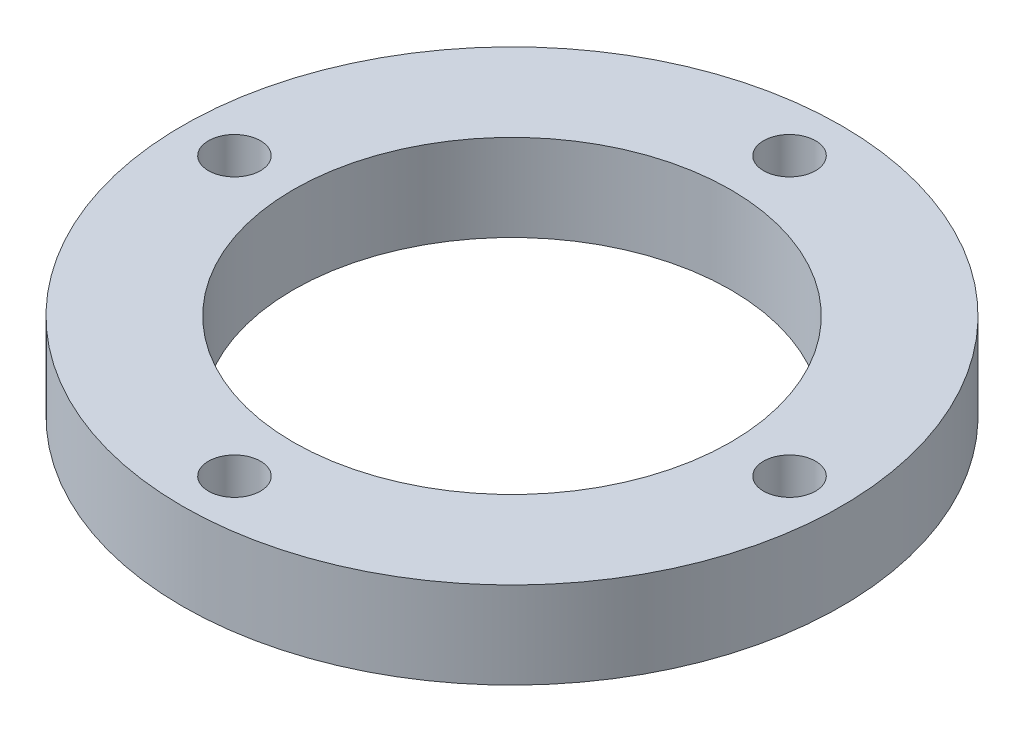
ISO-10303-21;
HEADER;
FILE_DESCRIPTION(('STEP AP214'),'2;1');
FILE_NAME('part.step','',(''),(''),'','','');
FILE_SCHEMA(('AUTOMOTIVE_DESIGN { 1 0 10303 214 1 1 1 1 }'));
ENDSEC;
DATA;
#1=APPLICATION_CONTEXT('core data for automotive mechanical design processes');
#2=APPLICATION_PROTOCOL_DEFINITION('international standard','automotive_design',2000,#1);
#3=PRODUCT_CONTEXT('',#1,'mechanical');
#4=PRODUCT('Part','Part','',(#3));
#5=PRODUCT_RELATED_PRODUCT_CATEGORY('part','',(#4));
#6=PRODUCT_DEFINITION_FORMATION('','',#4);
#7=PRODUCT_DEFINITION_CONTEXT('part definition',#1,'design');
#8=PRODUCT_DEFINITION('design','',#6,#7);
#9=PRODUCT_DEFINITION_SHAPE('','',#8);
#10=(LENGTH_UNIT() NAMED_UNIT(*) SI_UNIT(.MILLI.,.METRE.));
#11=(NAMED_UNIT(*) PLANE_ANGLE_UNIT() SI_UNIT($,.RADIAN.));
#12=(NAMED_UNIT(*) SI_UNIT($,.STERADIAN.) SOLID_ANGLE_UNIT());
#13=UNCERTAINTY_MEASURE_WITH_UNIT(LENGTH_MEASURE(1.E-05),#10,'distance_accuracy_value','');
#14=(GEOMETRIC_REPRESENTATION_CONTEXT(3) GLOBAL_UNCERTAINTY_ASSIGNED_CONTEXT((#13)) GLOBAL_UNIT_ASSIGNED_CONTEXT((#10,
#11,#12)) REPRESENTATION_CONTEXT('',''));
#15=CARTESIAN_POINT('',(0.,0.,0.));
#16=DIRECTION('',(0.,0.,1.));
#17=DIRECTION('',(1.,0.,0.));
#18=AXIS2_PLACEMENT_3D('',#15,#16,#17);
#19=CARTESIAN_POINT('',(0.,5.,0.));
#20=DIRECTION('',(0.,1.,0.));
#21=DIRECTION('',(0.,0.,1.));
#22=AXIS2_PLACEMENT_3D('',#19,#20,#21);
#23=PLANE('',#22);
#24=CARTESIAN_POINT('',(-16.,5.,-1.6759120133325E-13));
#25=DIRECTION('',(0.,1.,0.));
#26=DIRECTION('',(0.,0.,1.));
#27=AXIS2_PLACEMENT_3D('',#24,#25,#26);
#28=CIRCLE('',#27,1.5);
#29=CARTESIAN_POINT('',(-16.,5.,1.49999999999983));
#30=VERTEX_POINT('',#29);
#31=EDGE_CURVE('E66',#30,#30,#28,.T.);
#32=ORIENTED_EDGE('',*,*,#31,.F.);
#33=EDGE_LOOP('',(#32));
#34=FACE_BOUND('',#33,.T.);
#35=CARTESIAN_POINT('',(-1.117274675555E-13,5.,16.));
#36=DIRECTION('',(0.,1.,0.));
#37=DIRECTION('',(0.,0.,1.));
#38=AXIS2_PLACEMENT_3D('',#35,#36,#37);
#39=CIRCLE('',#38,1.5);
#40=CARTESIAN_POINT('',(-1.117274675555E-13,5.,17.5));
#41=VERTEX_POINT('',#40);
#42=EDGE_CURVE('E60',#41,#41,#39,.T.);
#43=ORIENTED_EDGE('',*,*,#42,.F.);
#44=EDGE_LOOP('',(#43));
#45=FACE_BOUND('',#44,.T.);
#46=CARTESIAN_POINT('',(16.,5.,0.));
#47=DIRECTION('',(0.,1.,0.));
#48=DIRECTION('',(0.,0.,1.));
#49=AXIS2_PLACEMENT_3D('',#46,#47,#48);
#50=CIRCLE('',#49,1.5);
#51=CARTESIAN_POINT('',(16.,5.,1.50000000000006));
#52=VERTEX_POINT('',#51);
#53=EDGE_CURVE('E54',#52,#52,#50,.T.);
#54=ORIENTED_EDGE('',*,*,#53,.F.);
#55=EDGE_LOOP('',(#54));
#56=FACE_BOUND('',#55,.T.);
#57=CARTESIAN_POINT('',(0.,5.,-16.));
#58=DIRECTION('',(0.,1.,0.));
#59=DIRECTION('',(0.,0.,1.));
#60=AXIS2_PLACEMENT_3D('',#57,#58,#59);
#61=CIRCLE('',#60,1.5);
#62=CARTESIAN_POINT('',(0.,5.,-14.5));
#63=VERTEX_POINT('',#62);
#64=EDGE_CURVE('E48',#63,#63,#61,.T.);
#65=ORIENTED_EDGE('',*,*,#64,.F.);
#66=EDGE_LOOP('',(#65));
#67=FACE_BOUND('',#66,.T.);
#68=CARTESIAN_POINT('',(0.,5.,0.));
#69=DIRECTION('',(0.,1.,0.));
#70=DIRECTION('',(0.,0.,1.));
#71=AXIS2_PLACEMENT_3D('',#68,#69,#70);
#72=CIRCLE('',#71,19.);
#73=CARTESIAN_POINT('',(0.,5.,19.));
#74=VERTEX_POINT('',#73);
#75=EDGE_CURVE('E10',#74,#74,#72,.T.);
#76=ORIENTED_EDGE('',*,*,#75,.T.);
#77=EDGE_LOOP('',(#76));
#78=FACE_BOUND('',#77,.T.);
#79=CARTESIAN_POINT('',(0.,5.,0.));
#80=DIRECTION('',(0.,1.,0.));
#81=DIRECTION('',(0.,0.,1.));
#82=AXIS2_PLACEMENT_3D('',#79,#80,#81);
#83=CIRCLE('',#82,12.61);
#84=CARTESIAN_POINT('',(0.,5.,12.61));
#85=VERTEX_POINT('',#84);
#86=EDGE_CURVE('E40',#85,#85,#83,.T.);
#87=ORIENTED_EDGE('',*,*,#86,.F.);
#88=EDGE_LOOP('',(#87));
#89=FACE_BOUND('',#88,.T.);
#90=ADVANCED_FACE('F29',(#34,#45,#56,#67,#78,#89),#23,.T.);
#91=CARTESIAN_POINT('',(0.,0.,0.));
#92=DIRECTION('',(0.,1.,0.));
#93=DIRECTION('',(0.,0.,1.));
#94=AXIS2_PLACEMENT_3D('',#91,#92,#93);
#95=PLANE('',#94);
#96=CARTESIAN_POINT('',(-16.,0.,-1.6759120133325E-13));
#97=DIRECTION('',(0.,1.,0.));
#98=DIRECTION('',(0.,0.,1.));
#99=AXIS2_PLACEMENT_3D('',#96,#97,#98);
#100=CIRCLE('',#99,1.5);
#101=CARTESIAN_POINT('',(-16.,0.,1.49999999999983));
#102=VERTEX_POINT('',#101);
#103=EDGE_CURVE('E63',#102,#102,#100,.T.);
#104=ORIENTED_EDGE('',*,*,#103,.T.);
#105=EDGE_LOOP('',(#104));
#106=FACE_BOUND('',#105,.T.);
#107=CARTESIAN_POINT('',(-1.117274675555E-13,0.,16.));
#108=DIRECTION('',(0.,1.,0.));
#109=DIRECTION('',(0.,0.,1.));
#110=AXIS2_PLACEMENT_3D('',#107,#108,#109);
#111=CIRCLE('',#110,1.5);
#112=CARTESIAN_POINT('',(-1.117274675555E-13,0.,17.5));
#113=VERTEX_POINT('',#112);
#114=EDGE_CURVE('E57',#113,#113,#111,.T.);
#115=ORIENTED_EDGE('',*,*,#114,.T.);
#116=EDGE_LOOP('',(#115));
#117=FACE_BOUND('',#116,.T.);
#118=CARTESIAN_POINT('',(16.,0.,0.));
#119=DIRECTION('',(0.,1.,0.));
#120=DIRECTION('',(0.,0.,1.));
#121=AXIS2_PLACEMENT_3D('',#118,#119,#120);
#122=CIRCLE('',#121,1.5);
#123=CARTESIAN_POINT('',(16.,0.,1.50000000000006));
#124=VERTEX_POINT('',#123);
#125=EDGE_CURVE('E51',#124,#124,#122,.T.);
#126=ORIENTED_EDGE('',*,*,#125,.T.);
#127=EDGE_LOOP('',(#126));
#128=FACE_BOUND('',#127,.T.);
#129=CARTESIAN_POINT('',(0.,0.,-16.));
#130=DIRECTION('',(0.,1.,0.));
#131=DIRECTION('',(0.,0.,1.));
#132=AXIS2_PLACEMENT_3D('',#129,#130,#131);
#133=CIRCLE('',#132,1.5);
#134=CARTESIAN_POINT('',(0.,0.,-14.5));
#135=VERTEX_POINT('',#134);
#136=EDGE_CURVE('E45',#135,#135,#133,.T.);
#137=ORIENTED_EDGE('',*,*,#136,.T.);
#138=EDGE_LOOP('',(#137));
#139=FACE_BOUND('',#138,.T.);
#140=CARTESIAN_POINT('',(0.,0.,0.));
#141=DIRECTION('',(0.,1.,0.));
#142=DIRECTION('',(0.,0.,1.));
#143=AXIS2_PLACEMENT_3D('',#140,#141,#142);
#144=CIRCLE('',#143,19.);
#145=CARTESIAN_POINT('',(0.,0.,19.));
#146=VERTEX_POINT('',#145);
#147=EDGE_CURVE('E33',#146,#146,#144,.T.);
#148=ORIENTED_EDGE('',*,*,#147,.F.);
#149=EDGE_LOOP('',(#148));
#150=FACE_BOUND('',#149,.T.);
#151=CARTESIAN_POINT('',(0.,0.,0.));
#152=DIRECTION('',(0.,1.,0.));
#153=DIRECTION('',(0.,0.,1.));
#154=AXIS2_PLACEMENT_3D('',#151,#152,#153);
#155=CIRCLE('',#154,12.61);
#156=CARTESIAN_POINT('',(0.,0.,12.61));
#157=VERTEX_POINT('',#156);
#158=EDGE_CURVE('E42',#157,#157,#155,.T.);
#159=ORIENTED_EDGE('',*,*,#158,.T.);
#160=EDGE_LOOP('',(#159));
#161=FACE_BOUND('',#160,.T.);
#162=ADVANCED_FACE('F72',(#106,#117,#128,#139,#150,#161),#95,.F.);
#163=CARTESIAN_POINT('',(0.,5.,0.));
#164=DIRECTION('',(0.,-1.,0.));
#165=DIRECTION('',(0.,0.,-1.));
#166=AXIS2_PLACEMENT_3D('',#163,#164,#165);
#167=CYLINDRICAL_SURFACE('',#166,19.);
#168=ORIENTED_EDGE('',*,*,#75,.F.);
#169=EDGE_LOOP('',(#168));
#170=FACE_BOUND('',#169,.T.);
#171=ORIENTED_EDGE('',*,*,#147,.T.);
#172=EDGE_LOOP('',(#171));
#173=FACE_BOUND('',#172,.T.);
#174=ADVANCED_FACE('F31',(#170,#173),#167,.T.);
#175=CARTESIAN_POINT('',(0.,5.,0.));
#176=DIRECTION('',(0.,-1.,0.));
#177=DIRECTION('',(0.,0.,-1.));
#178=AXIS2_PLACEMENT_3D('',#175,#176,#177);
#179=CYLINDRICAL_SURFACE('',#178,12.61);
#180=ORIENTED_EDGE('',*,*,#86,.T.);
#181=EDGE_LOOP('',(#180));
#182=FACE_BOUND('',#181,.T.);
#183=ORIENTED_EDGE('',*,*,#158,.F.);
#184=EDGE_LOOP('',(#183));
#185=FACE_BOUND('',#184,.T.);
#186=ADVANCED_FACE('F93',(#182,#185),#179,.F.);
#187=CARTESIAN_POINT('',(0.,0.,-16.));
#188=DIRECTION('',(0.,1.,0.));
#189=DIRECTION('',(0.,0.,1.));
#190=AXIS2_PLACEMENT_3D('',#187,#188,#189);
#191=CYLINDRICAL_SURFACE('',#190,1.5);
#192=ORIENTED_EDGE('',*,*,#136,.F.);
#193=EDGE_LOOP('',(#192));
#194=FACE_BOUND('',#193,.T.);
#195=ORIENTED_EDGE('',*,*,#64,.T.);
#196=EDGE_LOOP('',(#195));
#197=FACE_BOUND('',#196,.T.);
#198=ADVANCED_FACE('F96',(#194,#197),#191,.F.);
#199=CARTESIAN_POINT('',(16.,0.,0.));
#200=DIRECTION('',(0.,1.,0.));
#201=DIRECTION('',(0.,0.,1.));
#202=AXIS2_PLACEMENT_3D('',#199,#200,#201);
#203=CYLINDRICAL_SURFACE('',#202,1.5);
#204=ORIENTED_EDGE('',*,*,#125,.F.);
#205=EDGE_LOOP('',(#204));
#206=FACE_BOUND('',#205,.T.);
#207=ORIENTED_EDGE('',*,*,#53,.T.);
#208=EDGE_LOOP('',(#207));
#209=FACE_BOUND('',#208,.T.);
#210=ADVANCED_FACE('F108',(#206,#209),#203,.F.);
#211=CARTESIAN_POINT('',(-1.117274675555E-13,0.,16.));
#212=DIRECTION('',(0.,1.,0.));
#213=DIRECTION('',(0.,0.,1.));
#214=AXIS2_PLACEMENT_3D('',#211,#212,#213);
#215=CYLINDRICAL_SURFACE('',#214,1.5);
#216=ORIENTED_EDGE('',*,*,#114,.F.);
#217=EDGE_LOOP('',(#216));
#218=FACE_BOUND('',#217,.T.);
#219=ORIENTED_EDGE('',*,*,#42,.T.);
#220=EDGE_LOOP('',(#219));
#221=FACE_BOUND('',#220,.T.);
#222=ADVANCED_FACE('F78',(#218,#221),#215,.F.);
#223=CARTESIAN_POINT('',(-16.,0.,-1.6759120133325E-13));
#224=DIRECTION('',(0.,1.,0.));
#225=DIRECTION('',(0.,0.,1.));
#226=AXIS2_PLACEMENT_3D('',#223,#224,#225);
#227=CYLINDRICAL_SURFACE('',#226,1.5);
#228=ORIENTED_EDGE('',*,*,#103,.F.);
#229=EDGE_LOOP('',(#228));
#230=FACE_BOUND('',#229,.T.);
#231=ORIENTED_EDGE('',*,*,#31,.T.);
#232=EDGE_LOOP('',(#231));
#233=FACE_BOUND('',#232,.T.);
#234=ADVANCED_FACE('F75',(#230,#233),#227,.F.);
#235=CLOSED_SHELL('',(#90,#162,#174,#186,#198,#210,#222,#234));
#236=MANIFOLD_SOLID_BREP('B2',#235);
#237=ADVANCED_BREP_SHAPE_REPRESENTATION('',(#18,#236),#14);
#238=SHAPE_DEFINITION_REPRESENTATION(#9,#237);
ENDSEC;
END-ISO-10303-21;
